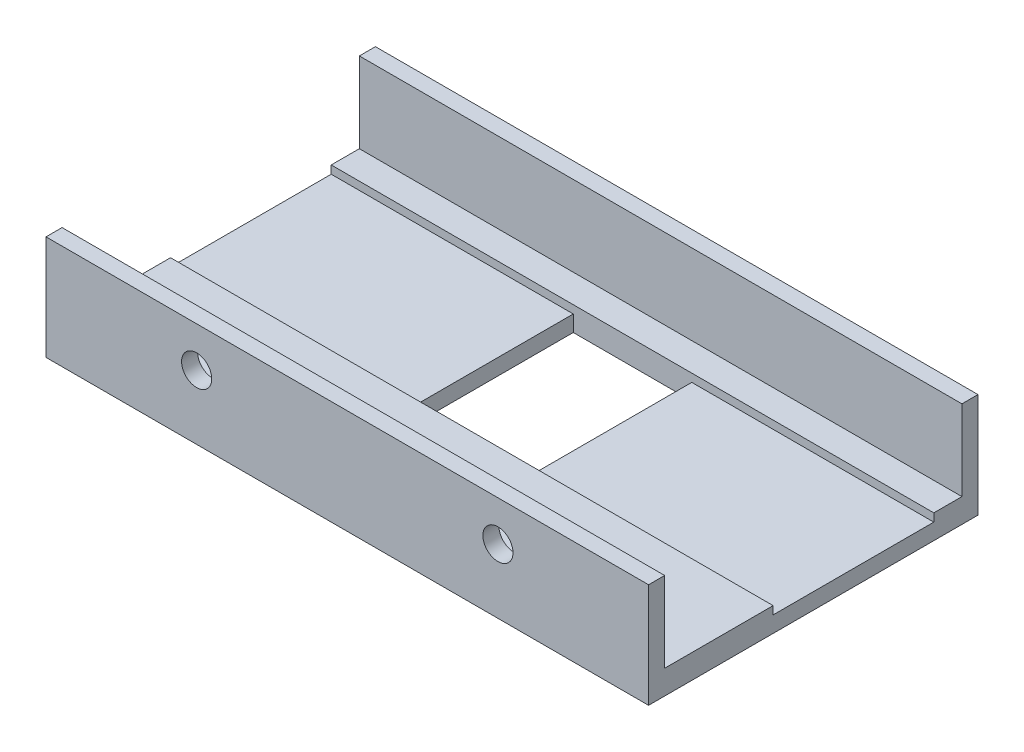
ISO-10303-21;
HEADER;
FILE_DESCRIPTION(('STEP AP214'),'2;1');
FILE_NAME('part.step','',(''),(''),'','','');
FILE_SCHEMA(('AUTOMOTIVE_DESIGN { 1 0 10303 214 1 1 1 1 }'));
ENDSEC;
DATA;
#1=APPLICATION_CONTEXT('core data for automotive mechanical design processes');
#2=APPLICATION_PROTOCOL_DEFINITION('international standard','automotive_design',2000,#1);
#3=PRODUCT_CONTEXT('',#1,'mechanical');
#4=PRODUCT('Part','Part','',(#3));
#5=PRODUCT_RELATED_PRODUCT_CATEGORY('part','',(#4));
#6=PRODUCT_DEFINITION_FORMATION('','',#4);
#7=PRODUCT_DEFINITION_CONTEXT('part definition',#1,'design');
#8=PRODUCT_DEFINITION('design','',#6,#7);
#9=PRODUCT_DEFINITION_SHAPE('','',#8);
#10=(LENGTH_UNIT() NAMED_UNIT(*) SI_UNIT(.MILLI.,.METRE.));
#11=(NAMED_UNIT(*) PLANE_ANGLE_UNIT() SI_UNIT($,.RADIAN.));
#12=(NAMED_UNIT(*) SI_UNIT($,.STERADIAN.) SOLID_ANGLE_UNIT());
#13=UNCERTAINTY_MEASURE_WITH_UNIT(LENGTH_MEASURE(1.E-05),#10,'distance_accuracy_value','');
#14=(GEOMETRIC_REPRESENTATION_CONTEXT(3) GLOBAL_UNCERTAINTY_ASSIGNED_CONTEXT((#13)) GLOBAL_UNIT_ASSIGNED_CONTEXT((#10,
#11,#12)) REPRESENTATION_CONTEXT('',''));
#15=CARTESIAN_POINT('',(0.,0.,0.));
#16=DIRECTION('',(0.,0.,1.));
#17=DIRECTION('',(1.,0.,0.));
#18=AXIS2_PLACEMENT_3D('',#15,#16,#17);
#19=CARTESIAN_POINT('',(37.5,3.,20.5));
#20=DIRECTION('',(0.,1.,0.));
#21=DIRECTION('',(0.,0.,1.));
#22=AXIS2_PLACEMENT_3D('',#19,#20,#21);
#23=PLANE('',#22);
#24=DIRECTION('',(-1.,0.,0.));
#25=VECTOR('',#24,1.);
#26=CARTESIAN_POINT('',(-7.375,3.,-15.));
#27=LINE('',#26,#25);
#28=CARTESIAN_POINT('',(37.5,3.,-15.));
#29=VERTEX_POINT('',#28);
#30=CARTESIAN_POINT('',(-37.5,3.,-15.));
#31=VERTEX_POINT('',#30);
#32=EDGE_CURVE('E184',#29,#31,#27,.T.);
#33=ORIENTED_EDGE('',*,*,#32,.F.);
#34=DIRECTION('',(0.,0.,-1.));
#35=VECTOR('',#34,1.);
#36=CARTESIAN_POINT('',(37.5,3.,-20.5));
#37=LINE('',#36,#35);
#38=CARTESIAN_POINT('',(37.5,3.,-18.5));
#39=VERTEX_POINT('',#38);
#40=EDGE_CURVE('E38',#29,#39,#37,.T.);
#41=ORIENTED_EDGE('',*,*,#40,.T.);
#42=DIRECTION('',(1.,0.,0.));
#43=VECTOR('',#42,1.);
#44=CARTESIAN_POINT('',(-37.5,3.,-18.5));
#45=LINE('',#44,#43);
#46=CARTESIAN_POINT('',(-37.5,3.,-18.5));
#47=VERTEX_POINT('',#46);
#48=EDGE_CURVE('E231',#47,#39,#45,.T.);
#49=ORIENTED_EDGE('',*,*,#48,.F.);
#50=DIRECTION('',(0.,0.,1.));
#51=VECTOR('',#50,1.);
#52=CARTESIAN_POINT('',(-37.5,3.,-20.5));
#53=LINE('',#52,#51);
#54=EDGE_CURVE('E261',#47,#31,#53,.T.);
#55=ORIENTED_EDGE('',*,*,#54,.T.);
#56=EDGE_LOOP('',(#33,#41,#49,#55));
#57=FACE_BOUND('',#56,.T.);
#58=ADVANCED_FACE('F34',(#57),#23,.T.);
#59=CARTESIAN_POINT('',(7.375,0.,-15.));
#60=DIRECTION('',(1.,0.,0.));
#61=DIRECTION('',(0.,0.,-1.));
#62=AXIS2_PLACEMENT_3D('',#59,#60,#61);
#63=PLANE('',#62);
#64=DIRECTION('',(0.,0.,1.));
#65=VECTOR('',#64,1.);
#66=CARTESIAN_POINT('',(7.375,2.,-15.));
#67=LINE('',#66,#65);
#68=CARTESIAN_POINT('',(7.375,2.,-15.));
#69=VERTEX_POINT('',#68);
#70=CARTESIAN_POINT('',(7.375,2.,5.00000000000001));
#71=VERTEX_POINT('',#70);
#72=EDGE_CURVE('E181',#69,#71,#67,.T.);
#73=ORIENTED_EDGE('',*,*,#72,.F.);
#74=DIRECTION('',(0.,1.,0.));
#75=VECTOR('',#74,1.);
#76=CARTESIAN_POINT('',(7.375,0.,-15.));
#77=LINE('',#76,#75);
#78=CARTESIAN_POINT('',(7.375,0.,-15.));
#79=VERTEX_POINT('',#78);
#80=EDGE_CURVE('E198',#79,#69,#77,.T.);
#81=ORIENTED_EDGE('',*,*,#80,.F.);
#82=DIRECTION('',(0.,0.,-1.));
#83=VECTOR('',#82,1.);
#84=CARTESIAN_POINT('',(7.375,0.,-15.));
#85=LINE('',#84,#83);
#86=CARTESIAN_POINT('',(7.375,0.,5.00000000000001));
#87=VERTEX_POINT('',#86);
#88=EDGE_CURVE('E185',#87,#79,#85,.T.);
#89=ORIENTED_EDGE('',*,*,#88,.F.);
#90=DIRECTION('',(0.,1.,0.));
#91=VECTOR('',#90,1.);
#92=CARTESIAN_POINT('',(7.375,0.,5.00000000000001));
#93=LINE('',#92,#91);
#94=EDGE_CURVE('E201',#87,#71,#93,.T.);
#95=ORIENTED_EDGE('',*,*,#94,.T.);
#96=EDGE_LOOP('',(#73,#81,#89,#95));
#97=FACE_BOUND('',#96,.T.);
#98=ADVANCED_FACE('F323',(#97),#63,.F.);
#99=CARTESIAN_POINT('',(-7.375,0.,-15.));
#100=DIRECTION('',(-1.,0.,0.));
#101=DIRECTION('',(0.,0.,1.));
#102=AXIS2_PLACEMENT_3D('',#99,#100,#101);
#103=PLANE('',#102);
#104=DIRECTION('',(0.,0.,-1.));
#105=VECTOR('',#104,1.);
#106=CARTESIAN_POINT('',(-7.375,2.,-15.));
#107=LINE('',#106,#105);
#108=CARTESIAN_POINT('',(-7.375,2.,5.00000000000001));
#109=VERTEX_POINT('',#108);
#110=CARTESIAN_POINT('',(-7.375,2.,-15.));
#111=VERTEX_POINT('',#110);
#112=EDGE_CURVE('E179',#109,#111,#107,.T.);
#113=ORIENTED_EDGE('',*,*,#112,.F.);
#114=DIRECTION('',(0.,1.,0.));
#115=VECTOR('',#114,1.);
#116=CARTESIAN_POINT('',(-7.375,0.,5.00000000000001));
#117=LINE('',#116,#115);
#118=CARTESIAN_POINT('',(-7.375,0.,5.00000000000001));
#119=VERTEX_POINT('',#118);
#120=EDGE_CURVE('E155',#119,#109,#117,.T.);
#121=ORIENTED_EDGE('',*,*,#120,.F.);
#122=DIRECTION('',(0.,0.,1.));
#123=VECTOR('',#122,1.);
#124=CARTESIAN_POINT('',(-7.375,0.,-15.));
#125=LINE('',#124,#123);
#126=CARTESIAN_POINT('',(-7.375,0.,-15.));
#127=VERTEX_POINT('',#126);
#128=EDGE_CURVE('E192',#127,#119,#125,.T.);
#129=ORIENTED_EDGE('',*,*,#128,.F.);
#130=DIRECTION('',(0.,1.,0.));
#131=VECTOR('',#130,1.);
#132=CARTESIAN_POINT('',(-7.375,0.,-15.));
#133=LINE('',#132,#131);
#134=EDGE_CURVE('E206',#127,#111,#133,.T.);
#135=ORIENTED_EDGE('',*,*,#134,.T.);
#136=EDGE_LOOP('',(#113,#121,#129,#135));
#137=FACE_BOUND('',#136,.T.);
#138=ADVANCED_FACE('F328',(#137),#103,.F.);
#139=DIRECTION('',(1.,0.,0.));
#140=VECTOR('',#139,1.);
#141=CARTESIAN_POINT('',(-7.375,3.,5.00000000000001));
#142=LINE('',#141,#140);
#143=CARTESIAN_POINT('',(-37.5,3.,5.00000000000001));
#144=VERTEX_POINT('',#143);
#145=CARTESIAN_POINT('',(37.5,3.,5.00000000000001));
#146=VERTEX_POINT('',#145);
#147=EDGE_CURVE('E189',#144,#146,#142,.T.);
#148=ORIENTED_EDGE('',*,*,#147,.F.);
#149=CARTESIAN_POINT('',(-37.5,3.,18.5));
#150=VERTEX_POINT('',#149);
#151=EDGE_CURVE('E170',#144,#150,#53,.T.);
#152=ORIENTED_EDGE('',*,*,#151,.T.);
#153=DIRECTION('',(-1.,0.,0.));
#154=VECTOR('',#153,1.);
#155=CARTESIAN_POINT('',(-37.5,3.,18.5));
#156=LINE('',#155,#154);
#157=CARTESIAN_POINT('',(37.5,3.,18.5));
#158=VERTEX_POINT('',#157);
#159=EDGE_CURVE('E223',#158,#150,#156,.T.);
#160=ORIENTED_EDGE('',*,*,#159,.F.);
#161=EDGE_CURVE('E272',#158,#146,#37,.T.);
#162=ORIENTED_EDGE('',*,*,#161,.T.);
#163=EDGE_LOOP('',(#148,#152,#160,#162));
#164=FACE_BOUND('',#163,.T.);
#165=ADVANCED_FACE('F316',(#164),#23,.T.);
#166=CARTESIAN_POINT('',(37.5,3.,-20.5));
#167=DIRECTION('',(-1.,0.,0.));
#168=DIRECTION('',(0.,0.,1.));
#169=AXIS2_PLACEMENT_3D('',#166,#167,#168);
#170=PLANE('',#169);
#171=ORIENTED_EDGE('',*,*,#40,.F.);
#172=DIRECTION('',(0.,1.,0.));
#173=VECTOR('',#172,1.);
#174=CARTESIAN_POINT('',(37.5,2.,-15.));
#175=LINE('',#174,#173);
#176=CARTESIAN_POINT('',(37.5,2.,-15.));
#177=VERTEX_POINT('',#176);
#178=EDGE_CURVE('E174',#177,#29,#175,.T.);
#179=ORIENTED_EDGE('',*,*,#178,.F.);
#180=DIRECTION('',(0.,0.,-1.));
#181=VECTOR('',#180,1.);
#182=CARTESIAN_POINT('',(37.5,2.,-15.));
#183=LINE('',#182,#181);
#184=CARTESIAN_POINT('',(37.5,2.,5.00000000000001));
#185=VERTEX_POINT('',#184);
#186=EDGE_CURVE('E156',#185,#177,#183,.T.);
#187=ORIENTED_EDGE('',*,*,#186,.F.);
#188=DIRECTION('',(0.,1.,0.));
#189=VECTOR('',#188,1.);
#190=CARTESIAN_POINT('',(37.5,2.,5.00000000000001));
#191=LINE('',#190,#189);
#192=EDGE_CURVE('E171',#185,#146,#191,.T.);
#193=ORIENTED_EDGE('',*,*,#192,.T.);
#194=ORIENTED_EDGE('',*,*,#161,.F.);
#195=DIRECTION('',(0.,-1.,0.));
#196=VECTOR('',#195,1.);
#197=CARTESIAN_POINT('',(37.5,88.0266619276108,18.5));
#198=LINE('',#197,#196);
#199=CARTESIAN_POINT('',(37.5,13.,18.5));
#200=VERTEX_POINT('',#199);
#201=EDGE_CURVE('E227',#200,#158,#198,.T.);
#202=ORIENTED_EDGE('',*,*,#201,.F.);
#203=DIRECTION('',(0.,0.,-1.));
#204=VECTOR('',#203,1.);
#205=CARTESIAN_POINT('',(37.5,13.,20.5));
#206=LINE('',#205,#204);
#207=CARTESIAN_POINT('',(37.5,13.,20.5));
#208=VERTEX_POINT('',#207);
#209=EDGE_CURVE('E228',#208,#200,#206,.T.);
#210=ORIENTED_EDGE('',*,*,#209,.F.);
#211=DIRECTION('',(0.,-1.,0.));
#212=VECTOR('',#211,1.);
#213=CARTESIAN_POINT('',(37.5,3.,20.5));
#214=LINE('',#213,#212);
#215=CARTESIAN_POINT('',(37.5,0.,20.5));
#216=VERTEX_POINT('',#215);
#217=EDGE_CURVE('E285',#208,#216,#214,.T.);
#218=ORIENTED_EDGE('',*,*,#217,.T.);
#219=DIRECTION('',(0.,0.,-1.));
#220=VECTOR('',#219,1.);
#221=CARTESIAN_POINT('',(37.5,0.,-20.5));
#222=LINE('',#221,#220);
#223=CARTESIAN_POINT('',(37.5,0.,-20.5));
#224=VERTEX_POINT('',#223);
#225=EDGE_CURVE('E269',#216,#224,#222,.T.);
#226=ORIENTED_EDGE('',*,*,#225,.T.);
#227=DIRECTION('',(0.,-1.,0.));
#228=VECTOR('',#227,1.);
#229=CARTESIAN_POINT('',(37.5,3.,-20.5));
#230=LINE('',#229,#228);
#231=CARTESIAN_POINT('',(37.5,13.,-20.5));
#232=VERTEX_POINT('',#231);
#233=EDGE_CURVE('E12',#232,#224,#230,.T.);
#234=ORIENTED_EDGE('',*,*,#233,.F.);
#235=DIRECTION('',(0.,0.,-1.));
#236=VECTOR('',#235,1.);
#237=CARTESIAN_POINT('',(37.5,13.,-20.5));
#238=LINE('',#237,#236);
#239=CARTESIAN_POINT('',(37.5,13.,-18.5));
#240=VERTEX_POINT('',#239);
#241=EDGE_CURVE('E247',#240,#232,#238,.T.);
#242=ORIENTED_EDGE('',*,*,#241,.F.);
#243=DIRECTION('',(0.,-1.,0.));
#244=VECTOR('',#243,1.);
#245=CARTESIAN_POINT('',(37.5,13.,-18.5));
#246=LINE('',#245,#244);
#247=EDGE_CURVE('E253',#240,#39,#246,.T.);
#248=ORIENTED_EDGE('',*,*,#247,.T.);
#249=EDGE_LOOP('',(#171,#179,#187,#193,#194,#202,#210,#218,#226,#234,#242,#248));
#250=FACE_BOUND('',#249,.T.);
#251=ADVANCED_FACE('F36',(#250),#170,.F.);
#252=CARTESIAN_POINT('',(-37.5,3.,-20.5));
#253=DIRECTION('',(0.,0.,1.));
#254=DIRECTION('',(1.,0.,0.));
#255=AXIS2_PLACEMENT_3D('',#252,#253,#254);
#256=PLANE('',#255);
#257=DIRECTION('',(-1.,0.,0.));
#258=VECTOR('',#257,1.);
#259=CARTESIAN_POINT('',(-37.5,0.,-20.5));
#260=LINE('',#259,#258);
#261=CARTESIAN_POINT('',(-37.5,0.,-20.5));
#262=VERTEX_POINT('',#261);
#263=EDGE_CURVE('E279',#224,#262,#260,.T.);
#264=ORIENTED_EDGE('',*,*,#263,.T.);
#265=DIRECTION('',(0.,-1.,0.));
#266=VECTOR('',#265,1.);
#267=CARTESIAN_POINT('',(-37.5,3.,-20.5));
#268=LINE('',#267,#266);
#269=CARTESIAN_POINT('',(-37.5,13.,-20.5));
#270=VERTEX_POINT('',#269);
#271=EDGE_CURVE('E44',#270,#262,#268,.T.);
#272=ORIENTED_EDGE('',*,*,#271,.F.);
#273=DIRECTION('',(-1.,0.,0.));
#274=VECTOR('',#273,1.);
#275=CARTESIAN_POINT('',(-37.5,13.,-20.5));
#276=LINE('',#275,#274);
#277=EDGE_CURVE('E250',#232,#270,#276,.T.);
#278=ORIENTED_EDGE('',*,*,#277,.F.);
#279=ORIENTED_EDGE('',*,*,#233,.T.);
#280=EDGE_LOOP('',(#264,#272,#278,#279));
#281=FACE_BOUND('',#280,.T.);
#282=ADVANCED_FACE('F343',(#281),#256,.F.);
#283=CARTESIAN_POINT('',(-37.5,3.,-20.5));
#284=DIRECTION('',(1.,0.,0.));
#285=DIRECTION('',(0.,0.,-1.));
#286=AXIS2_PLACEMENT_3D('',#283,#284,#285);
#287=PLANE('',#286);
#288=DIRECTION('',(0.,0.,1.));
#289=VECTOR('',#288,1.);
#290=CARTESIAN_POINT('',(-37.5,2.,-15.));
#291=LINE('',#290,#289);
#292=CARTESIAN_POINT('',(-37.5,2.,-15.));
#293=VERTEX_POINT('',#292);
#294=CARTESIAN_POINT('',(-37.5,2.,5.00000000000001));
#295=VERTEX_POINT('',#294);
#296=EDGE_CURVE('E160',#293,#295,#291,.T.);
#297=ORIENTED_EDGE('',*,*,#296,.F.);
#298=DIRECTION('',(0.,1.,0.));
#299=VECTOR('',#298,1.);
#300=CARTESIAN_POINT('',(-37.5,2.,-15.));
#301=LINE('',#300,#299);
#302=EDGE_CURVE('E182',#293,#31,#301,.T.);
#303=ORIENTED_EDGE('',*,*,#302,.T.);
#304=ORIENTED_EDGE('',*,*,#54,.F.);
#305=DIRECTION('',(0.,-1.,0.));
#306=VECTOR('',#305,1.);
#307=CARTESIAN_POINT('',(-37.5,13.,-18.5));
#308=LINE('',#307,#306);
#309=CARTESIAN_POINT('',(-37.5,13.,-18.5));
#310=VERTEX_POINT('',#309);
#311=EDGE_CURVE('E264',#310,#47,#308,.T.);
#312=ORIENTED_EDGE('',*,*,#311,.F.);
#313=DIRECTION('',(0.,0.,1.));
#314=VECTOR('',#313,1.);
#315=CARTESIAN_POINT('',(-37.5,13.,-20.5));
#316=LINE('',#315,#314);
#317=EDGE_CURVE('E242',#270,#310,#316,.T.);
#318=ORIENTED_EDGE('',*,*,#317,.F.);
#319=ORIENTED_EDGE('',*,*,#271,.T.);
#320=DIRECTION('',(0.,0.,1.));
#321=VECTOR('',#320,1.);
#322=CARTESIAN_POINT('',(-37.5,0.,-20.5));
#323=LINE('',#322,#321);
#324=CARTESIAN_POINT('',(-37.5,0.,20.5));
#325=VERTEX_POINT('',#324);
#326=EDGE_CURVE('E281',#262,#325,#323,.T.);
#327=ORIENTED_EDGE('',*,*,#326,.T.);
#328=DIRECTION('',(0.,-1.,0.));
#329=VECTOR('',#328,1.);
#330=CARTESIAN_POINT('',(-37.5,3.,20.5));
#331=LINE('',#330,#329);
#332=CARTESIAN_POINT('',(-37.5,13.,20.5));
#333=VERTEX_POINT('',#332);
#334=EDGE_CURVE('E288',#333,#325,#331,.T.);
#335=ORIENTED_EDGE('',*,*,#334,.F.);
#336=DIRECTION('',(0.,0.,1.));
#337=VECTOR('',#336,1.);
#338=CARTESIAN_POINT('',(-37.5,13.,20.5));
#339=LINE('',#338,#337);
#340=CARTESIAN_POINT('',(-37.5,13.,18.5));
#341=VERTEX_POINT('',#340);
#342=EDGE_CURVE('E235',#341,#333,#339,.T.);
#343=ORIENTED_EDGE('',*,*,#342,.F.);
#344=DIRECTION('',(0.,-1.,0.));
#345=VECTOR('',#344,1.);
#346=CARTESIAN_POINT('',(-37.5,88.0266619276108,18.5));
#347=LINE('',#346,#345);
#348=EDGE_CURVE('E222',#341,#150,#347,.T.);
#349=ORIENTED_EDGE('',*,*,#348,.T.);
#350=ORIENTED_EDGE('',*,*,#151,.F.);
#351=DIRECTION('',(0.,1.,0.));
#352=VECTOR('',#351,1.);
#353=CARTESIAN_POINT('',(-37.5,2.,5.00000000000001));
#354=LINE('',#353,#352);
#355=EDGE_CURVE('E152',#295,#144,#354,.T.);
#356=ORIENTED_EDGE('',*,*,#355,.F.);
#357=EDGE_LOOP('',(#297,#303,#304,#312,#318,#319,#327,#335,#343,#349,#350,#356));
#358=FACE_BOUND('',#357,.T.);
#359=ADVANCED_FACE('F168',(#358),#287,.F.);
#360=CARTESIAN_POINT('',(-37.5,3.,20.5));
#361=DIRECTION('',(0.,0.,-1.));
#362=DIRECTION('',(-1.,0.,0.));
#363=AXIS2_PLACEMENT_3D('',#360,#361,#362);
#364=PLANE('',#363);
#365=CARTESIAN_POINT('',(18.75,7.99999999999999,20.5));
#366=DIRECTION('',(0.,0.,1.));
#367=DIRECTION('',(-1.,0.,0.));
#368=AXIS2_PLACEMENT_3D('',#365,#366,#367);
#369=CIRCLE('',#368,1.875);
#370=CARTESIAN_POINT('',(16.875,7.99999999999999,20.5));
#371=VERTEX_POINT('',#370);
#372=EDGE_CURVE('E204',#371,#371,#369,.T.);
#373=ORIENTED_EDGE('',*,*,#372,.F.);
#374=EDGE_LOOP('',(#373));
#375=FACE_BOUND('',#374,.T.);
#376=CARTESIAN_POINT('',(-18.75,7.99999999999999,20.5));
#377=DIRECTION('',(0.,0.,1.));
#378=DIRECTION('',(1.,0.,0.));
#379=AXIS2_PLACEMENT_3D('',#376,#377,#378);
#380=CIRCLE('',#379,1.875);
#381=CARTESIAN_POINT('',(-16.875,7.99999999999999,20.5));
#382=VERTEX_POINT('',#381);
#383=EDGE_CURVE('E216',#382,#382,#380,.T.);
#384=ORIENTED_EDGE('',*,*,#383,.F.);
#385=EDGE_LOOP('',(#384));
#386=FACE_BOUND('',#385,.T.);
#387=DIRECTION('',(1.,0.,0.));
#388=VECTOR('',#387,1.);
#389=CARTESIAN_POINT('',(-37.5,0.,20.5));
#390=LINE('',#389,#388);
#391=EDGE_CURVE('E283',#325,#216,#390,.T.);
#392=ORIENTED_EDGE('',*,*,#391,.T.);
#393=ORIENTED_EDGE('',*,*,#217,.F.);
#394=DIRECTION('',(1.,0.,0.));
#395=VECTOR('',#394,1.);
#396=CARTESIAN_POINT('',(-37.5,13.,20.5));
#397=LINE('',#396,#395);
#398=EDGE_CURVE('E232',#333,#208,#397,.T.);
#399=ORIENTED_EDGE('',*,*,#398,.F.);
#400=ORIENTED_EDGE('',*,*,#334,.T.);
#401=EDGE_LOOP('',(#392,#393,#399,#400));
#402=FACE_BOUND('',#401,.T.);
#403=ADVANCED_FACE('F302',(#375,#386,#402),#364,.F.);
#404=CARTESIAN_POINT('',(37.5,0.,20.5));
#405=DIRECTION('',(0.,1.,0.));
#406=DIRECTION('',(0.,0.,1.));
#407=AXIS2_PLACEMENT_3D('',#404,#405,#406);
#408=PLANE('',#407);
#409=DIRECTION('',(1.,0.,0.));
#410=VECTOR('',#409,1.);
#411=CARTESIAN_POINT('',(-7.375,0.,5.00000000000001));
#412=LINE('',#411,#410);
#413=EDGE_CURVE('E195',#119,#87,#412,.T.);
#414=ORIENTED_EDGE('',*,*,#413,.T.);
#415=ORIENTED_EDGE('',*,*,#88,.T.);
#416=DIRECTION('',(-1.,0.,0.));
#417=VECTOR('',#416,1.);
#418=CARTESIAN_POINT('',(-7.375,0.,-15.));
#419=LINE('',#418,#417);
#420=EDGE_CURVE('E188',#79,#127,#419,.T.);
#421=ORIENTED_EDGE('',*,*,#420,.T.);
#422=ORIENTED_EDGE('',*,*,#128,.T.);
#423=EDGE_LOOP('',(#414,#415,#421,#422));
#424=FACE_BOUND('',#423,.T.);
#425=ORIENTED_EDGE('',*,*,#225,.F.);
#426=ORIENTED_EDGE('',*,*,#391,.F.);
#427=ORIENTED_EDGE('',*,*,#326,.F.);
#428=ORIENTED_EDGE('',*,*,#263,.F.);
#429=EDGE_LOOP('',(#425,#426,#427,#428));
#430=FACE_BOUND('',#429,.T.);
#431=ADVANCED_FACE('F300',(#424,#430),#408,.F.);
#432=CARTESIAN_POINT('',(-37.5,13.,-18.5));
#433=DIRECTION('',(0.,0.,-1.));
#434=DIRECTION('',(-1.,0.,0.));
#435=AXIS2_PLACEMENT_3D('',#432,#433,#434);
#436=PLANE('',#435);
#437=ORIENTED_EDGE('',*,*,#48,.T.);
#438=ORIENTED_EDGE('',*,*,#247,.F.);
#439=DIRECTION('',(1.,0.,0.));
#440=VECTOR('',#439,1.);
#441=CARTESIAN_POINT('',(-37.5,13.,-18.5));
#442=LINE('',#441,#440);
#443=EDGE_CURVE('E245',#310,#240,#442,.T.);
#444=ORIENTED_EDGE('',*,*,#443,.F.);
#445=ORIENTED_EDGE('',*,*,#311,.T.);
#446=EDGE_LOOP('',(#437,#438,#444,#445));
#447=FACE_BOUND('',#446,.T.);
#448=ADVANCED_FACE('F340',(#447),#436,.F.);
#449=CARTESIAN_POINT('',(-37.5,13.,-18.5));
#450=DIRECTION('',(0.,1.,0.));
#451=DIRECTION('',(0.,0.,1.));
#452=AXIS2_PLACEMENT_3D('',#449,#450,#451);
#453=PLANE('',#452);
#454=ORIENTED_EDGE('',*,*,#317,.T.);
#455=ORIENTED_EDGE('',*,*,#443,.T.);
#456=ORIENTED_EDGE('',*,*,#241,.T.);
#457=ORIENTED_EDGE('',*,*,#277,.T.);
#458=EDGE_LOOP('',(#454,#455,#456,#457));
#459=FACE_BOUND('',#458,.T.);
#460=ADVANCED_FACE('F342',(#459),#453,.T.);
#461=CARTESIAN_POINT('',(-37.5,88.0266619276108,18.5));
#462=DIRECTION('',(0.,0.,1.));
#463=DIRECTION('',(1.,0.,0.));
#464=AXIS2_PLACEMENT_3D('',#461,#462,#463);
#465=PLANE('',#464);
#466=CARTESIAN_POINT('',(18.75,7.99999999999999,18.5));
#467=DIRECTION('',(0.,0.,1.));
#468=DIRECTION('',(1.,0.,0.));
#469=AXIS2_PLACEMENT_3D('',#466,#467,#468);
#470=CIRCLE('',#469,1.875);
#471=CARTESIAN_POINT('',(20.625,7.99999999999999,18.5));
#472=VERTEX_POINT('',#471);
#473=EDGE_CURVE('E213',#472,#472,#470,.F.);
#474=ORIENTED_EDGE('',*,*,#473,.F.);
#475=EDGE_LOOP('',(#474));
#476=FACE_BOUND('',#475,.T.);
#477=CARTESIAN_POINT('',(-18.75,7.99999999999999,18.5));
#478=DIRECTION('',(0.,0.,1.));
#479=DIRECTION('',(1.,0.,0.));
#480=AXIS2_PLACEMENT_3D('',#477,#478,#479);
#481=CIRCLE('',#480,1.875);
#482=CARTESIAN_POINT('',(-16.875,7.99999999999999,18.5));
#483=VERTEX_POINT('',#482);
#484=EDGE_CURVE('E219',#483,#483,#481,.F.);
#485=ORIENTED_EDGE('',*,*,#484,.F.);
#486=EDGE_LOOP('',(#485));
#487=FACE_BOUND('',#486,.T.);
#488=DIRECTION('',(-1.,0.,0.));
#489=VECTOR('',#488,1.);
#490=CARTESIAN_POINT('',(-37.5,13.,18.5));
#491=LINE('',#490,#489);
#492=EDGE_CURVE('E226',#200,#341,#491,.T.);
#493=ORIENTED_EDGE('',*,*,#492,.F.);
#494=ORIENTED_EDGE('',*,*,#201,.T.);
#495=ORIENTED_EDGE('',*,*,#159,.T.);
#496=ORIENTED_EDGE('',*,*,#348,.F.);
#497=EDGE_LOOP('',(#493,#494,#495,#496));
#498=FACE_BOUND('',#497,.T.);
#499=ADVANCED_FACE('F314',(#476,#487,#498),#465,.F.);
#500=CARTESIAN_POINT('',(-37.5,13.,-18.5));
#501=DIRECTION('',(0.,1.,0.));
#502=DIRECTION('',(0.,0.,1.));
#503=AXIS2_PLACEMENT_3D('',#500,#501,#502);
#504=PLANE('',#503);
#505=ORIENTED_EDGE('',*,*,#492,.T.);
#506=ORIENTED_EDGE('',*,*,#342,.T.);
#507=ORIENTED_EDGE('',*,*,#398,.T.);
#508=ORIENTED_EDGE('',*,*,#209,.T.);
#509=EDGE_LOOP('',(#505,#506,#507,#508));
#510=FACE_BOUND('',#509,.T.);
#511=ADVANCED_FACE('F310',(#510),#504,.T.);
#512=CARTESIAN_POINT('',(-18.75,7.99999999999999,-63.1164995573811));
#513=DIRECTION('',(0.,0.,1.));
#514=DIRECTION('',(1.,0.,0.));
#515=AXIS2_PLACEMENT_3D('',#512,#513,#514);
#516=CYLINDRICAL_SURFACE('',#515,1.875);
#517=ORIENTED_EDGE('',*,*,#484,.T.);
#518=EDGE_LOOP('',(#517));
#519=FACE_BOUND('',#518,.T.);
#520=ORIENTED_EDGE('',*,*,#383,.T.);
#521=EDGE_LOOP('',(#520));
#522=FACE_BOUND('',#521,.T.);
#523=ADVANCED_FACE('F373',(#519,#522),#516,.F.);
#524=CARTESIAN_POINT('',(18.75,7.99999999999999,-63.1164995573811));
#525=DIRECTION('',(0.,0.,1.));
#526=DIRECTION('',(1.,0.,0.));
#527=AXIS2_PLACEMENT_3D('',#524,#525,#526);
#528=CYLINDRICAL_SURFACE('',#527,1.875);
#529=ORIENTED_EDGE('',*,*,#473,.T.);
#530=EDGE_LOOP('',(#529));
#531=FACE_BOUND('',#530,.T.);
#532=ORIENTED_EDGE('',*,*,#372,.T.);
#533=EDGE_LOOP('',(#532));
#534=FACE_BOUND('',#533,.T.);
#535=ADVANCED_FACE('F370',(#531,#534),#528,.F.);
#536=CARTESIAN_POINT('',(-7.375,0.,5.00000000000001));
#537=DIRECTION('',(0.,0.,1.));
#538=DIRECTION('',(1.,0.,0.));
#539=AXIS2_PLACEMENT_3D('',#536,#537,#538);
#540=PLANE('',#539);
#541=ORIENTED_EDGE('',*,*,#147,.T.);
#542=ORIENTED_EDGE('',*,*,#192,.F.);
#543=DIRECTION('',(1.,0.,0.));
#544=VECTOR('',#543,1.);
#545=CARTESIAN_POINT('',(-37.5,2.,5.00000000000001));
#546=LINE('',#545,#544);
#547=EDGE_CURVE('E157',#71,#185,#546,.T.);
#548=ORIENTED_EDGE('',*,*,#547,.F.);
#549=ORIENTED_EDGE('',*,*,#94,.F.);
#550=ORIENTED_EDGE('',*,*,#413,.F.);
#551=ORIENTED_EDGE('',*,*,#120,.T.);
#552=EDGE_CURVE('E52',#295,#109,#546,.T.);
#553=ORIENTED_EDGE('',*,*,#552,.F.);
#554=ORIENTED_EDGE('',*,*,#355,.T.);
#555=EDGE_LOOP('',(#541,#542,#548,#549,#550,#551,#553,#554));
#556=FACE_BOUND('',#555,.T.);
#557=ADVANCED_FACE('F150',(#556),#540,.F.);
#558=CARTESIAN_POINT('',(-7.375,0.,-15.));
#559=DIRECTION('',(0.,0.,-1.));
#560=DIRECTION('',(-1.,0.,0.));
#561=AXIS2_PLACEMENT_3D('',#558,#559,#560);
#562=PLANE('',#561);
#563=ORIENTED_EDGE('',*,*,#32,.T.);
#564=ORIENTED_EDGE('',*,*,#302,.F.);
#565=DIRECTION('',(-1.,0.,0.));
#566=VECTOR('',#565,1.);
#567=CARTESIAN_POINT('',(-37.5,2.,-15.));
#568=LINE('',#567,#566);
#569=EDGE_CURVE('E163',#111,#293,#568,.T.);
#570=ORIENTED_EDGE('',*,*,#569,.F.);
#571=ORIENTED_EDGE('',*,*,#134,.F.);
#572=ORIENTED_EDGE('',*,*,#420,.F.);
#573=ORIENTED_EDGE('',*,*,#80,.T.);
#574=EDGE_CURVE('E60',#177,#69,#568,.T.);
#575=ORIENTED_EDGE('',*,*,#574,.F.);
#576=ORIENTED_EDGE('',*,*,#178,.T.);
#577=EDGE_LOOP('',(#563,#564,#570,#571,#572,#573,#575,#576));
#578=FACE_BOUND('',#577,.T.);
#579=ADVANCED_FACE('F330',(#578),#562,.F.);
#580=CARTESIAN_POINT('',(-37.5,2.,5.00000000000001));
#581=DIRECTION('',(0.,1.,0.));
#582=DIRECTION('',(0.,0.,1.));
#583=AXIS2_PLACEMENT_3D('',#580,#581,#582);
#584=PLANE('',#583);
#585=ORIENTED_EDGE('',*,*,#112,.T.);
#586=ORIENTED_EDGE('',*,*,#569,.T.);
#587=ORIENTED_EDGE('',*,*,#296,.T.);
#588=ORIENTED_EDGE('',*,*,#552,.T.);
#589=EDGE_LOOP('',(#585,#586,#587,#588));
#590=FACE_BOUND('',#589,.T.);
#591=ADVANCED_FACE('F161',(#590),#584,.T.);
#592=ORIENTED_EDGE('',*,*,#72,.T.);
#593=ORIENTED_EDGE('',*,*,#547,.T.);
#594=ORIENTED_EDGE('',*,*,#186,.T.);
#595=ORIENTED_EDGE('',*,*,#574,.T.);
#596=EDGE_LOOP('',(#592,#593,#594,#595));
#597=FACE_BOUND('',#596,.T.);
#598=ADVANCED_FACE('F435',(#597),#584,.T.);
#599=CLOSED_SHELL('',(#58,#98,#138,#165,#251,#282,#359,#403,#431,#448,#460,#499,#511,#523,#535,
#557,#579,#591,#598));
#600=MANIFOLD_SOLID_BREP('B2',#599);
#601=ADVANCED_BREP_SHAPE_REPRESENTATION('',(#18,#600),#14);
#602=SHAPE_DEFINITION_REPRESENTATION(#9,#601);
ENDSEC;
END-ISO-10303-21;
